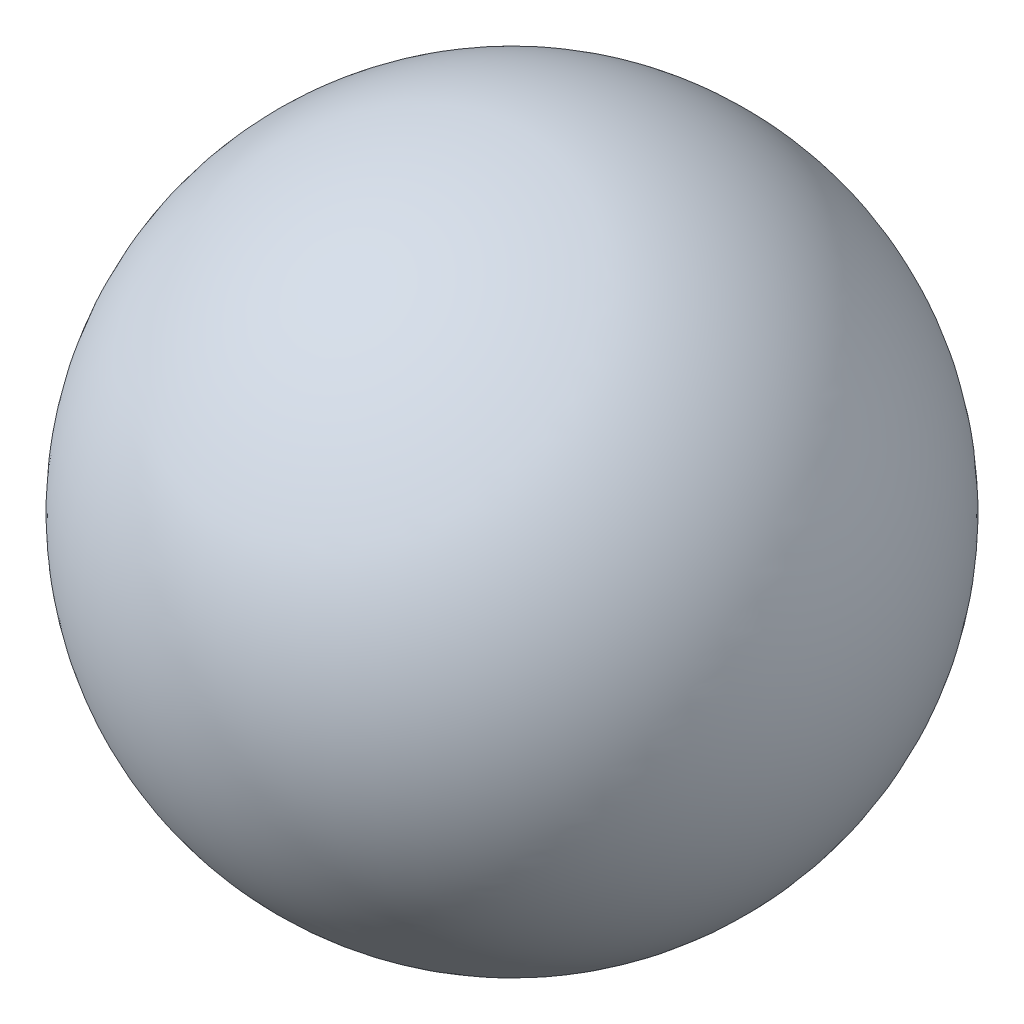
ISO-10303-21;
HEADER;
FILE_DESCRIPTION(('STEP AP214'),'2;1');
FILE_NAME('part.step','',(''),(''),'','','');
FILE_SCHEMA(('AUTOMOTIVE_DESIGN { 1 0 10303 214 1 1 1 1 }'));
ENDSEC;
DATA;
#1=APPLICATION_CONTEXT('core data for automotive mechanical design processes');
#2=APPLICATION_PROTOCOL_DEFINITION('international standard','automotive_design',2000,#1);
#3=PRODUCT_CONTEXT('',#1,'mechanical');
#4=PRODUCT('Part','Part','',(#3));
#5=PRODUCT_RELATED_PRODUCT_CATEGORY('part','',(#4));
#6=PRODUCT_DEFINITION_FORMATION('','',#4);
#7=PRODUCT_DEFINITION_CONTEXT('part definition',#1,'design');
#8=PRODUCT_DEFINITION('design','',#6,#7);
#9=PRODUCT_DEFINITION_SHAPE('','',#8);
#10=(LENGTH_UNIT() NAMED_UNIT(*) SI_UNIT(.MILLI.,.METRE.));
#11=(NAMED_UNIT(*) PLANE_ANGLE_UNIT() SI_UNIT($,.RADIAN.));
#12=(NAMED_UNIT(*) SI_UNIT($,.STERADIAN.) SOLID_ANGLE_UNIT());
#13=UNCERTAINTY_MEASURE_WITH_UNIT(LENGTH_MEASURE(1.E-05),#10,'distance_accuracy_value','');
#14=(GEOMETRIC_REPRESENTATION_CONTEXT(3) GLOBAL_UNCERTAINTY_ASSIGNED_CONTEXT((#13)) GLOBAL_UNIT_ASSIGNED_CONTEXT((#10,
#11,#12)) REPRESENTATION_CONTEXT('',''));
#15=CARTESIAN_POINT('',(0.,0.,0.));
#16=DIRECTION('',(0.,0.,1.));
#17=DIRECTION('',(1.,0.,0.));
#18=AXIS2_PLACEMENT_3D('',#15,#16,#17);
#19=CARTESIAN_POINT('',(0.,-282.094791773878,0.));
#20=CARTESIAN_POINT('',(0.275206567989767,-282.094791773878,0.));
#21=CARTESIAN_POINT('',(0.819956691906442,-282.093764219018,0.));
#22=CARTESIAN_POINT('',(1.97022537853893,-282.089140222158,0.));
#23=CARTESIAN_POINT('',(3.32185084839033,-282.076809698607,0.));
#24=CARTESIAN_POINT('',(4.61256859878846,-282.058314250142,0.));
#25=CARTESIAN_POINT('',(5.93137683627969,-282.033654280988,0.));
#26=CARTESIAN_POINT('',(7.5837926650745,-281.9951243424,0.));
#27=CARTESIAN_POINT('',(9.5587525058228,-281.936561799917,0.));
#28=CARTESIAN_POINT('',(11.8662117281761,-281.850266055305,0.));
#29=CARTESIAN_POINT('',(14.5003682282594,-281.727002586782,0.));
#30=CARTESIAN_POINT('',(17.1341349500658,-281.579110134393,0.));
#31=CARTESIAN_POINT('',(19.7659470295512,-281.406601626041,0.));
#32=CARTESIAN_POINT('',(22.3962708685932,-281.209492144418,0.));
#33=CARTESIAN_POINT('',(25.6815874277399,-280.932375612013,0.));
#34=CARTESIAN_POINT('',(29.6196632710368,-280.550707052283,0.));
#35=CARTESIAN_POINT('',(34.2066601743201,-280.033875191426,0.));
#36=CARTESIAN_POINT('',(40.7445859284331,-279.173141804577,0.));
#37=CARTESIAN_POINT('',(53.774450194156,-277.126071826884,0.));
#38=CARTESIAN_POINT('',(70.5521707668533,-273.516509009342,0.));
#39=CARTESIAN_POINT('',(90.8211305801525,-267.539646798706,0.));
#40=CARTESIAN_POINT('',(112.939031132056,-258.859010277321,0.));
#41=CARTESIAN_POINT('',(131.967789434694,-249.695243354973,0.));
#42=CARTESIAN_POINT('',(150.258529120921,-239.13508055408,0.));
#43=CARTESIAN_POINT('',(167.708963393396,-227.237574768132,0.));
#44=CARTESIAN_POINT('',(184.221499673995,-214.069267950509,0.));
#45=CARTESIAN_POINT('',(199.703796322889,-199.703793926483,0.));
#46=CARTESIAN_POINT('',(214.069265859624,-184.221502979162,0.));
#47=CARTESIAN_POINT('',(227.237577082283,-167.708958356805,0.));
#48=CARTESIAN_POINT('',(239.13507742698,-150.258537099692,0.));
#49=CARTESIAN_POINT('',(249.695247268911,-131.96777727864,0.));
#50=CARTESIAN_POINT('',(261.14994428098,-108.181867068828,0.));
#51=CARTESIAN_POINT('',(270.191935559821,-83.343174485049,0.));
#52=CARTESIAN_POINT('',(276.713225512345,-57.7269485348916,0.));
#53=CARTESIAN_POINT('',(280.647991016198,-31.6214466310537,0.));
#54=CARTESIAN_POINT('',(282.226321111719,-10.5601561964279,0.));
#55=CARTESIAN_POINT('',(282.226317327621,10.5601591103182,0.));
#56=CARTESIAN_POINT('',(280.64799559558,31.6214374972721,0.));
#57=CARTESIAN_POINT('',(277.500172692992,52.5058638681088,0.));
#58=CARTESIAN_POINT('',(272.800458540619,73.0966635301346,0.));
#59=CARTESIAN_POINT('',(266.575132174543,93.2786725098589,0.));
#60=CARTESIAN_POINT('',(258.859010388883,112.939032042763,0.));
#61=CARTESIAN_POINT('',(249.695243485568,131.967789042638,0.));
#62=CARTESIAN_POINT('',(239.135079833198,150.258529632632,0.));
#63=CARTESIAN_POINT('',(227.237575578665,167.708962980777,0.));
#64=CARTESIAN_POINT('',(214.069266813426,184.221500118489,0.));
#65=CARTESIAN_POINT('',(199.703795682401,199.703795729462,0.));
#66=CARTESIAN_POINT('',(184.221500166968,214.069266749975,0.));
#67=CARTESIAN_POINT('',(167.708962898131,227.237575684938,0.));
#68=CARTESIAN_POINT('',(150.258529079925,239.135079983235,0.));
#69=CARTESIAN_POINT('',(131.967788912011,249.695243694424,0.));
#70=CARTESIAN_POINT('',(112.939031248008,258.859010375844,0.));
#71=CARTESIAN_POINT('',(93.2786726939671,266.575132451632,0.));
#72=CARTESIAN_POINT('',(73.0966618215425,272.800458262324,0.));
#73=CARTESIAN_POINT('',(56.3666387424012,276.618976634288,0.));
#74=CARTESIAN_POINT('',(43.3597525432242,278.828848451719,0.));
#75=CARTESIAN_POINT('',(34.2066631785541,280.033875190687,0.));
#76=CARTESIAN_POINT('',(29.6196570986268,280.550707052798,0.));
#77=CARTESIAN_POINT('',(25.6815979571693,280.932375611707,0.));
#78=CARTESIAN_POINT('',(22.3962525675168,281.209492144593,0.));
#79=CARTESIAN_POINT('',(19.7659864928222,281.406601625925,0.));
#80=CARTESIAN_POINT('',(17.1340611211644,281.579110134467,0.));
#81=CARTESIAN_POINT('',(14.500502216505,281.727002586728,0.));
#82=CARTESIAN_POINT('',(12.1952782685392,281.834858121775,0.));
#83=CARTESIAN_POINT('',(10.218269970194,281.911905872861,0.));
#84=CARTESIAN_POINT('',(8.57105918611397,281.965843071174,0.));
#85=CARTESIAN_POINT('',(7.25346768287698,282.002830330109,0.));
#86=CARTESIAN_POINT('',(5.7658237920916,282.03750727485,0.));
#87=CARTESIAN_POINT('',(4.44851343979585,282.061139913714,0.));
#88=CARTESIAN_POINT('',(3.32386719978099,282.076424399221,0.));
#89=CARTESIAN_POINT('',(2.29322016455373,282.08567226662,0.));
#90=CARTESIAN_POINT('',(1.40057713611169,282.091452220588,0.));
#91=CARTESIAN_POINT('',(0.684223220586052,282.094021107733,0.));
#92=CARTESIAN_POINT('',(0.275206567993537,282.094791773878,0.));
#93=CARTESIAN_POINT('',(5.11638809629792E-12,282.094791773878,0.));
#94=B_SPLINE_CURVE_WITH_KNOTS('',4,(#19,#20,#21,#22,#23,#24,#25,#26,#27,#28,#29,#30,#31,#32,#33,
#34,#35,#36,#37,#38,#39,#40,#41,#42,#43,#44,#45,#46,#47,#48,#49,#50,#51,#52,#53,#54,#55,#56,#57,
#58,#59,#60,#61,#62,#63,#64,#65,#66,#67,#68,#69,#70,#71,#72,#73,#74,#75,#76,#77,#78,#79,#80,#81,
#82,#83,#84,#85,#86,#87,#88,#89,#90,#91,#92,#93),.UNSPECIFIED.,.F.,.F.,(5,1,1,1,1,1,1,1,1,1,1,1,
1,1,1,1,1,1,1,1,1,1,1,1,1,1,1,1,1,1,1,1,1,1,1,1,1,1,1,1,1,1,1,1,1,1,1,1,1,1,1,1,1,1,1,1,1,1,1,1,
1,1,1,1,1,1,1,1,1,1,1,5),(0.0826377290543253,0.0838798786702351,0.0851220282861449,
0.0863641779020547,0.0876063275179644,0.0888484771338742,0.090090626749784,0.0925749259816036,
0.0950592252134231,0.0975435244452427,0.100027823677062,0.102512122908882,0.104996422140701,
0.107480721372521,0.11244931983616,0.117417918299799,0.122386516763438,0.132323713690717,
0.162135304472551,0.182009698327108,0.201884092181664,0.22175848603622,0.241632879890776,
0.261507273745331,0.281381667599887,0.301256061454442,0.321130455308997,0.341004849163553,
0.360879243018108,0.380753636872664,0.400628030727219,0.440376818436329,0.460251212290885,
0.48012560614544,0.499999999999996,0.519874393854552,0.539748787709108,0.559623181563664,
0.579497575418219,0.599371969272774,0.619246363127329,0.639120756981885,0.65899515083644,
0.678869544690995,0.69874393854555,0.718618332400105,0.738492726254661,0.758367120109216,
0.778241513963772,0.798115907818328,0.817990301672884,0.83786469552744,0.857739089381996,
0.877613483236552,0.882582081700192,0.887550680163832,0.892519278627472,0.895003577859292,
0.897487877091112,0.899972176322932,0.902456475554752,0.904940774786572,0.907425074018392,
0.908667223634303,0.909909373250212,0.911151522866122,0.912393672482033,0.914256896905898,
0.914877971713853,0.915499046521808,0.916120121329763,0.917362270945673),.UNSPECIFIED.);
#95=CARTESIAN_POINT('',(0.,282.094791773878,0.));
#96=DIRECTION('',(0.,1.,0.));
#97=AXIS1_PLACEMENT('',#95,#96);
#98=SURFACE_OF_REVOLUTION('',#94,#97);
#99=CARTESIAN_POINT('',(0.,282.094791773878,0.));
#100=VERTEX_POINT('',#99);
#101=VERTEX_LOOP('',#100);
#102=FACE_BOUND('',#101,.T.);
#103=CARTESIAN_POINT('',(0.,-282.094791773878,0.));
#104=VERTEX_POINT('',#103);
#105=VERTEX_LOOP('',#104);
#106=FACE_BOUND('',#105,.T.);
#107=ADVANCED_FACE('F40',(#102,#106),#98,.T.);
#108=CLOSED_SHELL('',(#107));
#109=MANIFOLD_SOLID_BREP('B2',#108);
#110=ADVANCED_BREP_SHAPE_REPRESENTATION('',(#18,#109),#14);
#111=SHAPE_DEFINITION_REPRESENTATION(#9,#110);
ENDSEC;
END-ISO-10303-21;
